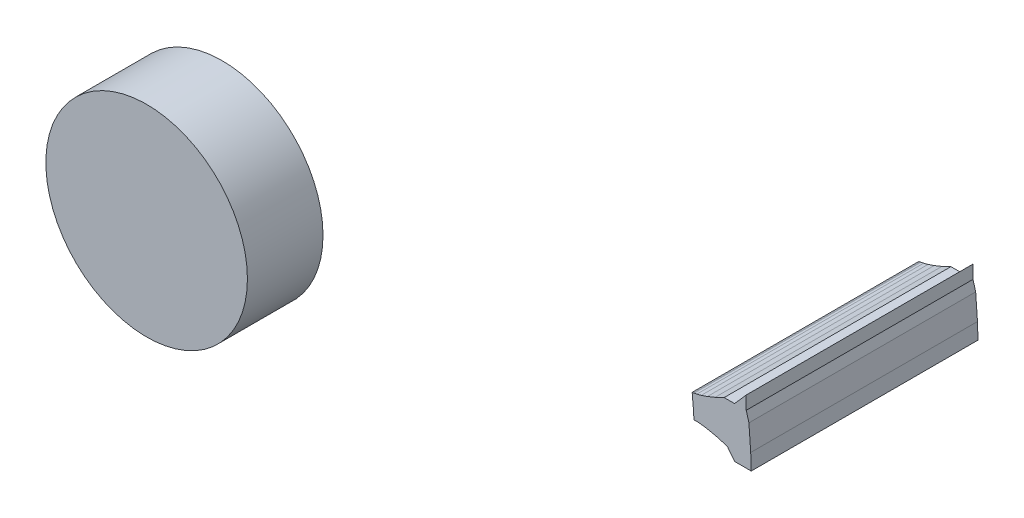
ISO-10303-21;
HEADER;
FILE_DESCRIPTION(('STEP AP214'),'2;1');
FILE_NAME('part.step','',(''),(''),'','','');
FILE_SCHEMA(('AUTOMOTIVE_DESIGN { 1 0 10303 214 1 1 1 1 }'));
ENDSEC;
DATA;
#1=APPLICATION_CONTEXT('core data for automotive mechanical design processes');
#2=APPLICATION_PROTOCOL_DEFINITION('international standard','automotive_design',2000,#1);
#3=PRODUCT_CONTEXT('',#1,'mechanical');
#4=PRODUCT('Part','Part','',(#3));
#5=PRODUCT_RELATED_PRODUCT_CATEGORY('part','',(#4));
#6=PRODUCT_DEFINITION_FORMATION('','',#4);
#7=PRODUCT_DEFINITION_CONTEXT('part definition',#1,'design');
#8=PRODUCT_DEFINITION('design','',#6,#7);
#9=PRODUCT_DEFINITION_SHAPE('','',#8);
#10=(LENGTH_UNIT() NAMED_UNIT(*) SI_UNIT(.MILLI.,.METRE.));
#11=(NAMED_UNIT(*) PLANE_ANGLE_UNIT() SI_UNIT($,.RADIAN.));
#12=(NAMED_UNIT(*) SI_UNIT($,.STERADIAN.) SOLID_ANGLE_UNIT());
#13=UNCERTAINTY_MEASURE_WITH_UNIT(LENGTH_MEASURE(1.E-05),#10,'distance_accuracy_value','');
#14=(GEOMETRIC_REPRESENTATION_CONTEXT(3) GLOBAL_UNCERTAINTY_ASSIGNED_CONTEXT((#13)) GLOBAL_UNIT_ASSIGNED_CONTEXT((#10,
#11,#12)) REPRESENTATION_CONTEXT('',''));
#15=CARTESIAN_POINT('',(0.,0.,0.));
#16=DIRECTION('',(0.,0.,1.));
#17=DIRECTION('',(1.,0.,0.));
#18=AXIS2_PLACEMENT_3D('',#15,#16,#17);
#19=CARTESIAN_POINT('',(0.,0.,24.));
#20=DIRECTION('',(0.,0.,-1.));
#21=DIRECTION('',(-1.,0.,0.));
#22=AXIS2_PLACEMENT_3D('',#19,#20,#21);
#23=CYLINDRICAL_SURFACE('',#22,8.);
#24=CARTESIAN_POINT('',(0.,0.,18.));
#25=DIRECTION('',(0.,0.,1.));
#26=DIRECTION('',(1.,0.,0.));
#27=AXIS2_PLACEMENT_3D('',#24,#25,#26);
#28=CIRCLE('',#27,8.);
#29=CARTESIAN_POINT('',(8.,0.,18.));
#30=VERTEX_POINT('',#29);
#31=EDGE_CURVE('E56',#30,#30,#28,.T.);
#32=ORIENTED_EDGE('',*,*,#31,.T.);
#33=EDGE_LOOP('',(#32));
#34=FACE_BOUND('',#33,.T.);
#35=CARTESIAN_POINT('',(0.,0.,24.));
#36=DIRECTION('',(0.,0.,1.));
#37=DIRECTION('',(1.,0.,0.));
#38=AXIS2_PLACEMENT_3D('',#35,#36,#37);
#39=CIRCLE('',#38,8.);
#40=CARTESIAN_POINT('',(8.,0.,24.));
#41=VERTEX_POINT('',#40);
#42=EDGE_CURVE('E12',#41,#41,#39,.T.);
#43=ORIENTED_EDGE('',*,*,#42,.F.);
#44=EDGE_LOOP('',(#43));
#45=FACE_BOUND('',#44,.T.);
#46=ADVANCED_FACE('F52',(#34,#45),#23,.T.);
#47=CARTESIAN_POINT('',(0.,0.,24.));
#48=DIRECTION('',(0.,0.,1.));
#49=DIRECTION('',(1.,0.,0.));
#50=AXIS2_PLACEMENT_3D('',#47,#48,#49);
#51=PLANE('',#50);
#52=ORIENTED_EDGE('',*,*,#42,.T.);
#53=EDGE_LOOP('',(#52));
#54=FACE_BOUND('',#53,.T.);
#55=ADVANCED_FACE('F68',(#54),#51,.T.);
#56=CARTESIAN_POINT('',(0.,0.,18.));
#57=DIRECTION('',(0.,0.,1.));
#58=DIRECTION('',(1.,0.,0.));
#59=AXIS2_PLACEMENT_3D('',#56,#57,#58);
#60=PLANE('',#59);
#61=ORIENTED_EDGE('',*,*,#31,.F.);
#62=EDGE_LOOP('',(#61));
#63=FACE_BOUND('',#62,.T.);
#64=ADVANCED_FACE('F54',(#63),#60,.F.);
#65=CLOSED_SHELL('',(#46,#55,#64));
#66=MANIFOLD_SOLID_BREP('B2',#65);
#67=CARTESIAN_POINT('',(0.,0.,0.));
#68=DIRECTION('',(0.,0.,1.));
#69=DIRECTION('',(1.,0.,0.));
#70=AXIS2_PLACEMENT_3D('',#67,#68,#69);
#71=PLANE('',#70);
#72=DIRECTION('',(0.0905981513208065,-0.995887531289177,0.));
#73=VECTOR('',#72,1.);
#74=CARTESIAN_POINT('',(37.3844000630674,2.94221547894263,0.));
#75=LINE('',#74,#73);
#76=CARTESIAN_POINT('',(37.3016220136472,3.8521416317403,0.));
#77=VERTEX_POINT('',#76);
#78=CARTESIAN_POINT('',(37.3844000630674,2.94221547894263,0.));
#79=VERTEX_POINT('',#78);
#80=EDGE_CURVE('E261',#77,#79,#75,.T.);
#81=ORIENTED_EDGE('',*,*,#80,.F.);
#82=DIRECTION('',(-0.994709920363927,-0.102723776846406,0.));
#83=VECTOR('',#82,1.);
#84=CARTESIAN_POINT('',(37.3016220136472,3.8521416317403,0.));
#85=LINE('',#84,#83);
#86=CARTESIAN_POINT('',(37.3888580736632,3.86115050696973,0.));
#87=VERTEX_POINT('',#86);
#88=EDGE_CURVE('E322',#87,#77,#85,.T.);
#89=ORIENTED_EDGE('',*,*,#88,.F.);
#90=DIRECTION('',(-0.989588019686755,-0.143928980029897,0.));
#91=VECTOR('',#90,1.);
#92=CARTESIAN_POINT('',(37.3888580736632,3.86115050696973,0.));
#93=LINE('',#92,#91);
#94=CARTESIAN_POINT('',(37.4610062205837,3.87164397393855,0.));
#95=VERTEX_POINT('',#94);
#96=EDGE_CURVE('E319',#95,#87,#93,.T.);
#97=ORIENTED_EDGE('',*,*,#96,.F.);
#98=DIRECTION('',(-0.980106852465355,-0.198470546304621,0.));
#99=VECTOR('',#98,1.);
#100=CARTESIAN_POINT('',(37.4610062205837,3.87164397393855,0.));
#101=LINE('',#100,#99);
#102=CARTESIAN_POINT('',(37.6753666553117,3.91505172328705,0.));
#103=VERTEX_POINT('',#102);
#104=EDGE_CURVE('E316',#103,#95,#101,.T.);
#105=ORIENTED_EDGE('',*,*,#104,.F.);
#106=DIRECTION('',(-0.966209673830987,-0.257757378546992,0.));
#107=VECTOR('',#106,1.);
#108=CARTESIAN_POINT('',(37.6753666553117,3.91505172328705,0.));
#109=LINE('',#108,#107);
#110=CARTESIAN_POINT('',(38.0275669136587,4.0090087781312,0.));
#111=VERTEX_POINT('',#110);
#112=EDGE_CURVE('E313',#111,#103,#109,.T.);
#113=ORIENTED_EDGE('',*,*,#112,.F.);
#114=DIRECTION('',(-0.948479410692144,-0.316838772079875,0.));
#115=VECTOR('',#114,1.);
#116=CARTESIAN_POINT('',(38.0275669136587,4.0090087781312,0.));
#117=LINE('',#116,#115);
#118=CARTESIAN_POINT('',(38.5115985785753,4.17069916026405,0.));
#119=VERTEX_POINT('',#118);
#120=EDGE_CURVE('E310',#119,#111,#117,.T.);
#121=ORIENTED_EDGE('',*,*,#120,.F.);
#122=DIRECTION('',(-0.927041376804356,-0.374959045353867,0.));
#123=VECTOR('',#122,1.);
#124=CARTESIAN_POINT('',(38.5115985785753,4.17069916026405,0.));
#125=LINE('',#124,#123);
#126=CARTESIAN_POINT('',(39.1198585891778,4.4167211810811,0.));
#127=VERTEX_POINT('',#126);
#128=EDGE_CURVE('E307',#127,#119,#125,.T.);
#129=ORIENTED_EDGE('',*,*,#128,.F.);
#130=DIRECTION('',(-0.901994032209611,-0.431748498385631,0.));
#131=VECTOR('',#130,1.);
#132=CARTESIAN_POINT('',(39.1198585891778,4.4167211810811,0.));
#133=LINE('',#132,#131);
#134=CARTESIAN_POINT('',(39.843200936271,4.76295625695094,0.));
#135=VERTEX_POINT('',#134);
#136=EDGE_CURVE('E304',#135,#127,#133,.T.);
#137=ORIENTED_EDGE('',*,*,#136,.F.);
#138=DIRECTION('',(-1.,0.,0.));
#139=VECTOR('',#138,1.);
#140=CARTESIAN_POINT('',(39.843200936271,4.76295625695094,0.));
#141=LINE('',#140,#139);
#142=CARTESIAN_POINT('',(40.670998457739,4.76295625695094,0.));
#143=VERTEX_POINT('',#142);
#144=EDGE_CURVE('E301',#143,#135,#141,.T.);
#145=ORIENTED_EDGE('',*,*,#144,.F.);
#146=DIRECTION('',(-0.659764565184818,-0.751472367107725,0.));
#147=VECTOR('',#146,1.);
#148=CARTESIAN_POINT('',(40.670998457739,4.76295625695094,0.));
#149=LINE('',#148,#147);
#150=CARTESIAN_POINT('',(41.5953853121842,5.81583362304391,0.));
#151=VERTEX_POINT('',#150);
#152=EDGE_CURVE('E298',#151,#143,#149,.T.);
#153=ORIENTED_EDGE('',*,*,#152,.F.);
#154=DIRECTION('',(0.,1.,0.));
#155=VECTOR('',#154,1.);
#156=CARTESIAN_POINT('',(41.5953853121842,5.81583362304391,0.));
#157=LINE('',#156,#155);
#158=CARTESIAN_POINT('',(41.5953853121842,4.76295625695094,0.));
#159=VERTEX_POINT('',#158);
#160=EDGE_CURVE('E294',#159,#151,#157,.T.);
#161=ORIENTED_EDGE('',*,*,#160,.F.);
#162=DIRECTION('',(-0.271684671108807,0.962386325487067,0.));
#163=VECTOR('',#162,1.);
#164=CARTESIAN_POINT('',(41.5953853121842,4.76295625695094,0.));
#165=LINE('',#164,#163);
#166=CARTESIAN_POINT('',(41.8082270446484,4.0090087781312,0.));
#167=VERTEX_POINT('',#166);
#168=EDGE_CURVE('E291',#167,#159,#165,.T.);
#169=ORIENTED_EDGE('',*,*,#168,.F.);
#170=DIRECTION('',(-0.07204163073137,0.997401625946923,0.));
#171=VECTOR('',#170,1.);
#172=CARTESIAN_POINT('',(41.8082270446484,4.0090087781312,0.));
#173=LINE('',#172,#171);
#174=CARTESIAN_POINT('',(41.9503880941238,2.04081815760224,0.));
#175=VERTEX_POINT('',#174);
#176=EDGE_CURVE('E295',#175,#167,#173,.T.);
#177=ORIENTED_EDGE('',*,*,#176,.F.);
#178=DIRECTION('',(-0.0336388276485857,0.999434054490054,0.));
#179=VECTOR('',#178,1.);
#180=CARTESIAN_POINT('',(41.9503880941238,2.04081815760239,0.));
#181=LINE('',#180,#179);
#182=CARTESIAN_POINT('',(41.9926721873227,0.784526970889533,0.));
#183=VERTEX_POINT('',#182);
#184=EDGE_CURVE('E96',#183,#175,#181,.T.);
#185=ORIENTED_EDGE('',*,*,#184,.F.);
#186=DIRECTION('',(1.,0.,0.));
#187=VECTOR('',#186,1.);
#188=CARTESIAN_POINT('',(41.9926721873227,0.784526970889533,0.));
#189=LINE('',#188,#187);
#190=CARTESIAN_POINT('',(40.670998457739,0.784526970889533,0.));
#191=VERTEX_POINT('',#190);
#192=EDGE_CURVE('E290',#191,#183,#189,.T.);
#193=ORIENTED_EDGE('',*,*,#192,.F.);
#194=DIRECTION('',(0.610333454309873,-0.792144604570515,0.));
#195=VECTOR('',#194,1.);
#196=CARTESIAN_POINT('',(40.670998457739,0.784526970889533,0.));
#197=LINE('',#196,#195);
#198=CARTESIAN_POINT('',(40.0977555807619,1.52853215182669,0.));
#199=VERTEX_POINT('',#198);
#200=EDGE_CURVE('E288',#199,#191,#197,.T.);
#201=ORIENTED_EDGE('',*,*,#200,.F.);
#202=DIRECTION('',(0.958429324952267,-0.285330035347738,0.));
#203=VECTOR('',#202,1.);
#204=CARTESIAN_POINT('',(40.0977555807619,1.52853215182669,0.));
#205=LINE('',#204,#203);
#206=CARTESIAN_POINT('',(39.329155686885,1.75734885137738,0.));
#207=VERTEX_POINT('',#206);
#208=EDGE_CURVE('E285',#207,#199,#205,.T.);
#209=ORIENTED_EDGE('',*,*,#208,.F.);
#210=DIRECTION('',(0.974284469427464,-0.225321487285269,0.));
#211=VECTOR('',#210,1.);
#212=CARTESIAN_POINT('',(39.329155686885,1.75734885137738,0.));
#213=LINE('',#212,#211);
#214=CARTESIAN_POINT('',(38.6898980479794,1.90518912439469,0.));
#215=VERTEX_POINT('',#214);
#216=EDGE_CURVE('E282',#215,#207,#213,.T.);
#217=ORIENTED_EDGE('',*,*,#216,.F.);
#218=DIRECTION('',(0.986366553671659,-0.164563124052426,0.));
#219=VECTOR('',#218,1.);
#220=CARTESIAN_POINT('',(38.6898980479794,1.90518912439469,0.));
#221=LINE('',#220,#219);
#222=CARTESIAN_POINT('',(38.1865316703758,1.98916961149967,0.));
#223=VERTEX_POINT('',#222);
#224=EDGE_CURVE('E279',#223,#215,#221,.T.);
#225=ORIENTED_EDGE('',*,*,#224,.F.);
#226=DIRECTION('',(0.994636163656049,-0.103435496554991,0.));
#227=VECTOR('',#226,1.);
#228=CARTESIAN_POINT('',(38.1865316703758,1.98916961149967,0.));
#229=LINE('',#228,#227);
#230=CARTESIAN_POINT('',(37.8239694612727,2.02687365193271,0.));
#231=VERTEX_POINT('',#230);
#232=EDGE_CURVE('E276',#231,#223,#229,.T.);
#233=ORIENTED_EDGE('',*,*,#232,.F.);
#234=DIRECTION('',(0.999087743059272,-0.0427045860386167,0.));
#235=VECTOR('',#234,1.);
#236=CARTESIAN_POINT('',(37.8239694612727,2.02687365193271,0.));
#237=LINE('',#236,#235);
#238=CARTESIAN_POINT('',(37.6054576914642,2.03621362706408,0.));
#239=VERTEX_POINT('',#238);
#240=EDGE_CURVE('E273',#239,#231,#237,.T.);
#241=ORIENTED_EDGE('',*,*,#240,.F.);
#242=DIRECTION('',(0.999920002445355,0.0126486643437654,0.));
#243=VECTOR('',#242,1.);
#244=CARTESIAN_POINT('',(37.6054576914642,2.03621362706408,0.));
#245=LINE('',#244,#243);
#246=CARTESIAN_POINT('',(37.5325562680334,2.03529144765683,0.));
#247=VERTEX_POINT('',#246);
#248=EDGE_CURVE('E267',#247,#239,#245,.T.);
#249=ORIENTED_EDGE('',*,*,#248,.F.);
#250=DIRECTION('',(0.998532931465171,0.0541478049377054,0.));
#251=VECTOR('',#250,1.);
#252=CARTESIAN_POINT('',(37.5325562680334,2.03529144765683,0.));
#253=LINE('',#252,#251);
#254=CARTESIAN_POINT('',(37.4449849299439,2.03054268516379,0.));
#255=VERTEX_POINT('',#254);
#256=EDGE_CURVE('E265',#255,#247,#253,.T.);
#257=ORIENTED_EDGE('',*,*,#256,.F.);
#258=DIRECTION('',(0.0602292012885529,-0.998184573769873,0.));
#259=VECTOR('',#258,1.);
#260=CARTESIAN_POINT('',(37.4449849299439,2.03054268516379,0.));
#261=LINE('',#260,#259);
#262=CARTESIAN_POINT('',(37.4174692012809,2.48656360690721,0.));
#263=VERTEX_POINT('',#262);
#264=EDGE_CURVE('E247',#263,#255,#261,.T.);
#265=ORIENTED_EDGE('',*,*,#264,.F.);
#266=DIRECTION('',(0.0723850640589552,-0.997376760558005,0.));
#267=VECTOR('',#266,1.);
#268=CARTESIAN_POINT('',(37.4174692012809,2.48656360690721,0.));
#269=LINE('',#268,#267);
#270=EDGE_CURVE('E257',#79,#263,#269,.T.);
#271=ORIENTED_EDGE('',*,*,#270,.F.);
#272=EDGE_LOOP('',(#81,#89,#97,#105,#113,#121,#129,#137,#145,#153,#161,#169,#177,#185,#193,#201,
#209,#217,#225,#233,#241,#249,#257,#265,#271));
#273=FACE_BOUND('',#272,.T.);
#274=ADVANCED_FACE('F93',(#273),#71,.F.);
#275=CARTESIAN_POINT('',(41.8082270446484,4.0090087781312,0.));
#276=DIRECTION('',(0.997401625946923,0.07204163073137,0.));
#277=DIRECTION('',(-0.07204163073137,0.997401625946923,0.));
#278=AXIS2_PLACEMENT_3D('',#275,#276,#277);
#279=PLANE('',#278);
#280=DIRECTION('',(-0.07204163073137,0.997401625946923,0.));
#281=VECTOR('',#280,1.);
#282=CARTESIAN_POINT('',(41.8082270446484,4.0090087781312,18.));
#283=LINE('',#282,#281);
#284=CARTESIAN_POINT('',(41.9503880941238,2.04081815760224,18.));
#285=VERTEX_POINT('',#284);
#286=CARTESIAN_POINT('',(41.8082270446484,4.0090087781312,18.));
#287=VERTEX_POINT('',#286);
#288=EDGE_CURVE('E360',#285,#287,#283,.T.);
#289=ORIENTED_EDGE('',*,*,#288,.F.);
#290=DIRECTION('',(0.,0.,1.));
#291=VECTOR('',#290,1.);
#292=CARTESIAN_POINT('',(41.9503880941238,2.04081815760239,0.));
#293=LINE('',#292,#291);
#294=EDGE_CURVE('E414',#175,#285,#293,.T.);
#295=ORIENTED_EDGE('',*,*,#294,.F.);
#296=ORIENTED_EDGE('',*,*,#176,.T.);
#297=DIRECTION('',(0.,0.,1.));
#298=VECTOR('',#297,1.);
#299=CARTESIAN_POINT('',(41.8082270446484,4.0090087781312,0.));
#300=LINE('',#299,#298);
#301=EDGE_CURVE('E412',#167,#287,#300,.T.);
#302=ORIENTED_EDGE('',*,*,#301,.T.);
#303=EDGE_LOOP('',(#289,#295,#296,#302));
#304=FACE_BOUND('',#303,.T.);
#305=ADVANCED_FACE('F445',(#304),#279,.T.);
#306=CARTESIAN_POINT('',(41.5953853121842,4.76295625695094,0.));
#307=DIRECTION('',(0.962386325487067,0.271684671108807,0.));
#308=DIRECTION('',(-0.271684671108807,0.962386325487067,0.));
#309=AXIS2_PLACEMENT_3D('',#306,#307,#308);
#310=PLANE('',#309);
#311=DIRECTION('',(-0.271684671108807,0.962386325487067,0.));
#312=VECTOR('',#311,1.);
#313=CARTESIAN_POINT('',(41.5953853121842,4.76295625695094,18.));
#314=LINE('',#313,#312);
#315=CARTESIAN_POINT('',(41.5953853121842,4.76295625695094,18.));
#316=VERTEX_POINT('',#315);
#317=EDGE_CURVE('E356',#287,#316,#314,.T.);
#318=ORIENTED_EDGE('',*,*,#317,.F.);
#319=ORIENTED_EDGE('',*,*,#301,.F.);
#320=ORIENTED_EDGE('',*,*,#168,.T.);
#321=DIRECTION('',(0.,0.,1.));
#322=VECTOR('',#321,1.);
#323=CARTESIAN_POINT('',(41.5953853121842,4.76295625695094,0.));
#324=LINE('',#323,#322);
#325=EDGE_CURVE('E410',#159,#316,#324,.T.);
#326=ORIENTED_EDGE('',*,*,#325,.T.);
#327=EDGE_LOOP('',(#318,#319,#320,#326));
#328=FACE_BOUND('',#327,.T.);
#329=ADVANCED_FACE('F451',(#328),#310,.T.);
#330=CARTESIAN_POINT('',(41.5953853121842,5.81583362304391,0.));
#331=DIRECTION('',(1.,0.,0.));
#332=DIRECTION('',(0.,0.,-1.));
#333=AXIS2_PLACEMENT_3D('',#330,#331,#332);
#334=PLANE('',#333);
#335=DIRECTION('',(0.,1.,0.));
#336=VECTOR('',#335,1.);
#337=CARTESIAN_POINT('',(41.5953853121842,5.81583362304391,18.));
#338=LINE('',#337,#336);
#339=CARTESIAN_POINT('',(41.5953853121842,5.81583362304391,18.));
#340=VERTEX_POINT('',#339);
#341=EDGE_CURVE('E359',#316,#340,#338,.T.);
#342=ORIENTED_EDGE('',*,*,#341,.F.);
#343=ORIENTED_EDGE('',*,*,#325,.F.);
#344=ORIENTED_EDGE('',*,*,#160,.T.);
#345=DIRECTION('',(0.,0.,1.));
#346=VECTOR('',#345,1.);
#347=CARTESIAN_POINT('',(41.5953853121842,5.81583362304391,0.));
#348=LINE('',#347,#346);
#349=EDGE_CURVE('E408',#151,#340,#348,.T.);
#350=ORIENTED_EDGE('',*,*,#349,.T.);
#351=EDGE_LOOP('',(#342,#343,#344,#350));
#352=FACE_BOUND('',#351,.T.);
#353=ADVANCED_FACE('F533',(#352),#334,.T.);
#354=CARTESIAN_POINT('',(40.670998457739,4.76295625695094,0.));
#355=DIRECTION('',(-0.751472367107725,0.659764565184818,0.));
#356=DIRECTION('',(-0.659764565184818,-0.751472367107725,0.));
#357=AXIS2_PLACEMENT_3D('',#354,#355,#356);
#358=PLANE('',#357);
#359=DIRECTION('',(-0.659764565184818,-0.751472367107725,0.));
#360=VECTOR('',#359,1.);
#361=CARTESIAN_POINT('',(40.670998457739,4.76295625695094,18.));
#362=LINE('',#361,#360);
#363=CARTESIAN_POINT('',(40.670998457739,4.76295625695094,18.));
#364=VERTEX_POINT('',#363);
#365=EDGE_CURVE('E363',#340,#364,#362,.T.);
#366=ORIENTED_EDGE('',*,*,#365,.F.);
#367=ORIENTED_EDGE('',*,*,#349,.F.);
#368=ORIENTED_EDGE('',*,*,#152,.T.);
#369=DIRECTION('',(0.,0.,1.));
#370=VECTOR('',#369,1.);
#371=CARTESIAN_POINT('',(40.670998457739,4.76295625695094,0.));
#372=LINE('',#371,#370);
#373=EDGE_CURVE('E406',#143,#364,#372,.T.);
#374=ORIENTED_EDGE('',*,*,#373,.T.);
#375=EDGE_LOOP('',(#366,#367,#368,#374));
#376=FACE_BOUND('',#375,.T.);
#377=ADVANCED_FACE('F531',(#376),#358,.T.);
#378=CARTESIAN_POINT('',(39.843200936271,4.76295625695094,0.));
#379=DIRECTION('',(0.,1.,0.));
#380=DIRECTION('',(0.,0.,1.));
#381=AXIS2_PLACEMENT_3D('',#378,#379,#380);
#382=PLANE('',#381);
#383=DIRECTION('',(-1.,0.,0.));
#384=VECTOR('',#383,1.);
#385=CARTESIAN_POINT('',(39.843200936271,4.76295625695094,18.));
#386=LINE('',#385,#384);
#387=CARTESIAN_POINT('',(39.843200936271,4.76295625695094,18.));
#388=VERTEX_POINT('',#387);
#389=EDGE_CURVE('E366',#364,#388,#386,.T.);
#390=ORIENTED_EDGE('',*,*,#389,.F.);
#391=ORIENTED_EDGE('',*,*,#373,.F.);
#392=ORIENTED_EDGE('',*,*,#144,.T.);
#393=DIRECTION('',(0.,0.,1.));
#394=VECTOR('',#393,1.);
#395=CARTESIAN_POINT('',(39.843200936271,4.76295625695094,0.));
#396=LINE('',#395,#394);
#397=EDGE_CURVE('E404',#135,#388,#396,.T.);
#398=ORIENTED_EDGE('',*,*,#397,.T.);
#399=EDGE_LOOP('',(#390,#391,#392,#398));
#400=FACE_BOUND('',#399,.T.);
#401=ADVANCED_FACE('F528',(#400),#382,.T.);
#402=CARTESIAN_POINT('',(39.1198585891778,4.4167211810811,0.));
#403=DIRECTION('',(-0.431748498385631,0.901994032209611,0.));
#404=DIRECTION('',(-0.901994032209611,-0.431748498385631,0.));
#405=AXIS2_PLACEMENT_3D('',#402,#403,#404);
#406=PLANE('',#405);
#407=DIRECTION('',(-0.901994032209611,-0.431748498385631,0.));
#408=VECTOR('',#407,1.);
#409=CARTESIAN_POINT('',(39.1198585891778,4.4167211810811,18.));
#410=LINE('',#409,#408);
#411=CARTESIAN_POINT('',(39.1198585891778,4.4167211810811,18.));
#412=VERTEX_POINT('',#411);
#413=EDGE_CURVE('E369',#388,#412,#410,.T.);
#414=ORIENTED_EDGE('',*,*,#413,.F.);
#415=ORIENTED_EDGE('',*,*,#397,.F.);
#416=ORIENTED_EDGE('',*,*,#136,.T.);
#417=DIRECTION('',(0.,0.,1.));
#418=VECTOR('',#417,1.);
#419=CARTESIAN_POINT('',(39.1198585891778,4.4167211810811,0.));
#420=LINE('',#419,#418);
#421=EDGE_CURVE('E402',#127,#412,#420,.T.);
#422=ORIENTED_EDGE('',*,*,#421,.T.);
#423=EDGE_LOOP('',(#414,#415,#416,#422));
#424=FACE_BOUND('',#423,.T.);
#425=ADVANCED_FACE('F525',(#424),#406,.T.);
#426=CARTESIAN_POINT('',(38.5115985785753,4.17069916026405,0.));
#427=DIRECTION('',(-0.374959045353867,0.927041376804356,0.));
#428=DIRECTION('',(-0.927041376804356,-0.374959045353867,0.));
#429=AXIS2_PLACEMENT_3D('',#426,#427,#428);
#430=PLANE('',#429);
#431=DIRECTION('',(-0.927041376804356,-0.374959045353867,0.));
#432=VECTOR('',#431,1.);
#433=CARTESIAN_POINT('',(38.5115985785753,4.17069916026405,18.));
#434=LINE('',#433,#432);
#435=CARTESIAN_POINT('',(38.5115985785753,4.17069916026405,18.));
#436=VERTEX_POINT('',#435);
#437=EDGE_CURVE('E372',#412,#436,#434,.T.);
#438=ORIENTED_EDGE('',*,*,#437,.F.);
#439=ORIENTED_EDGE('',*,*,#421,.F.);
#440=ORIENTED_EDGE('',*,*,#128,.T.);
#441=DIRECTION('',(0.,0.,1.));
#442=VECTOR('',#441,1.);
#443=CARTESIAN_POINT('',(38.5115985785753,4.17069916026405,0.));
#444=LINE('',#443,#442);
#445=EDGE_CURVE('E400',#119,#436,#444,.T.);
#446=ORIENTED_EDGE('',*,*,#445,.T.);
#447=EDGE_LOOP('',(#438,#439,#440,#446));
#448=FACE_BOUND('',#447,.T.);
#449=ADVANCED_FACE('F520',(#448),#430,.T.);
#450=CARTESIAN_POINT('',(38.0275669136587,4.0090087781312,0.));
#451=DIRECTION('',(-0.316838772079875,0.948479410692144,0.));
#452=DIRECTION('',(-0.948479410692144,-0.316838772079875,0.));
#453=AXIS2_PLACEMENT_3D('',#450,#451,#452);
#454=PLANE('',#453);
#455=DIRECTION('',(-0.948479410692144,-0.316838772079875,0.));
#456=VECTOR('',#455,1.);
#457=CARTESIAN_POINT('',(38.0275669136587,4.0090087781312,18.));
#458=LINE('',#457,#456);
#459=CARTESIAN_POINT('',(38.0275669136587,4.0090087781312,18.));
#460=VERTEX_POINT('',#459);
#461=EDGE_CURVE('E375',#436,#460,#458,.T.);
#462=ORIENTED_EDGE('',*,*,#461,.F.);
#463=ORIENTED_EDGE('',*,*,#445,.F.);
#464=ORIENTED_EDGE('',*,*,#120,.T.);
#465=DIRECTION('',(0.,0.,1.));
#466=VECTOR('',#465,1.);
#467=CARTESIAN_POINT('',(38.0275669136587,4.0090087781312,0.));
#468=LINE('',#467,#466);
#469=EDGE_CURVE('E398',#111,#460,#468,.T.);
#470=ORIENTED_EDGE('',*,*,#469,.T.);
#471=EDGE_LOOP('',(#462,#463,#464,#470));
#472=FACE_BOUND('',#471,.T.);
#473=ADVANCED_FACE('F517',(#472),#454,.T.);
#474=CARTESIAN_POINT('',(37.6753666553117,3.91505172328705,0.));
#475=DIRECTION('',(-0.257757378546992,0.966209673830987,0.));
#476=DIRECTION('',(-0.966209673830987,-0.257757378546992,0.));
#477=AXIS2_PLACEMENT_3D('',#474,#475,#476);
#478=PLANE('',#477);
#479=DIRECTION('',(-0.966209673830987,-0.257757378546992,0.));
#480=VECTOR('',#479,1.);
#481=CARTESIAN_POINT('',(37.6753666553117,3.91505172328705,18.));
#482=LINE('',#481,#480);
#483=CARTESIAN_POINT('',(37.6753666553117,3.91505172328705,18.));
#484=VERTEX_POINT('',#483);
#485=EDGE_CURVE('E378',#460,#484,#482,.T.);
#486=ORIENTED_EDGE('',*,*,#485,.F.);
#487=ORIENTED_EDGE('',*,*,#469,.F.);
#488=ORIENTED_EDGE('',*,*,#112,.T.);
#489=DIRECTION('',(0.,0.,1.));
#490=VECTOR('',#489,1.);
#491=CARTESIAN_POINT('',(37.6753666553117,3.91505172328705,0.));
#492=LINE('',#491,#490);
#493=EDGE_CURVE('E396',#103,#484,#492,.T.);
#494=ORIENTED_EDGE('',*,*,#493,.T.);
#495=EDGE_LOOP('',(#486,#487,#488,#494));
#496=FACE_BOUND('',#495,.T.);
#497=ADVANCED_FACE('F514',(#496),#478,.T.);
#498=CARTESIAN_POINT('',(37.4610062205837,3.87164397393855,0.));
#499=DIRECTION('',(-0.198470546304621,0.980106852465355,0.));
#500=DIRECTION('',(-0.980106852465355,-0.198470546304621,0.));
#501=AXIS2_PLACEMENT_3D('',#498,#499,#500);
#502=PLANE('',#501);
#503=DIRECTION('',(-0.980106852465355,-0.198470546304621,0.));
#504=VECTOR('',#503,1.);
#505=CARTESIAN_POINT('',(37.4610062205837,3.87164397393855,18.));
#506=LINE('',#505,#504);
#507=CARTESIAN_POINT('',(37.4610062205837,3.87164397393855,18.));
#508=VERTEX_POINT('',#507);
#509=EDGE_CURVE('E381',#484,#508,#506,.T.);
#510=ORIENTED_EDGE('',*,*,#509,.F.);
#511=ORIENTED_EDGE('',*,*,#493,.F.);
#512=ORIENTED_EDGE('',*,*,#104,.T.);
#513=DIRECTION('',(0.,0.,1.));
#514=VECTOR('',#513,1.);
#515=CARTESIAN_POINT('',(37.4610062205837,3.87164397393855,0.));
#516=LINE('',#515,#514);
#517=EDGE_CURVE('E394',#95,#508,#516,.T.);
#518=ORIENTED_EDGE('',*,*,#517,.T.);
#519=EDGE_LOOP('',(#510,#511,#512,#518));
#520=FACE_BOUND('',#519,.T.);
#521=ADVANCED_FACE('F508',(#520),#502,.T.);
#522=CARTESIAN_POINT('',(37.3888580736632,3.86115050696973,0.));
#523=DIRECTION('',(-0.143928980029897,0.989588019686755,0.));
#524=DIRECTION('',(-0.989588019686755,-0.143928980029897,0.));
#525=AXIS2_PLACEMENT_3D('',#522,#523,#524);
#526=PLANE('',#525);
#527=DIRECTION('',(-0.989588019686755,-0.143928980029897,0.));
#528=VECTOR('',#527,1.);
#529=CARTESIAN_POINT('',(37.3888580736632,3.86115050696973,18.));
#530=LINE('',#529,#528);
#531=CARTESIAN_POINT('',(37.3888580736632,3.86115050696973,18.));
#532=VERTEX_POINT('',#531);
#533=EDGE_CURVE('E384',#508,#532,#530,.T.);
#534=ORIENTED_EDGE('',*,*,#533,.F.);
#535=ORIENTED_EDGE('',*,*,#517,.F.);
#536=ORIENTED_EDGE('',*,*,#96,.T.);
#537=DIRECTION('',(0.,0.,1.));
#538=VECTOR('',#537,1.);
#539=CARTESIAN_POINT('',(37.3888580736632,3.86115050696973,0.));
#540=LINE('',#539,#538);
#541=EDGE_CURVE('E392',#87,#532,#540,.T.);
#542=ORIENTED_EDGE('',*,*,#541,.T.);
#543=EDGE_LOOP('',(#534,#535,#536,#542));
#544=FACE_BOUND('',#543,.T.);
#545=ADVANCED_FACE('F505',(#544),#526,.T.);
#546=CARTESIAN_POINT('',(37.3016220136472,3.8521416317403,0.));
#547=DIRECTION('',(-0.102723776846406,0.994709920363927,0.));
#548=DIRECTION('',(-0.994709920363927,-0.102723776846406,0.));
#549=AXIS2_PLACEMENT_3D('',#546,#547,#548);
#550=PLANE('',#549);
#551=DIRECTION('',(-0.994709920363927,-0.102723776846406,0.));
#552=VECTOR('',#551,1.);
#553=CARTESIAN_POINT('',(37.3016220136472,3.8521416317403,18.));
#554=LINE('',#553,#552);
#555=CARTESIAN_POINT('',(37.3016220136472,3.8521416317403,18.));
#556=VERTEX_POINT('',#555);
#557=EDGE_CURVE('E387',#532,#556,#554,.T.);
#558=ORIENTED_EDGE('',*,*,#557,.F.);
#559=ORIENTED_EDGE('',*,*,#541,.F.);
#560=ORIENTED_EDGE('',*,*,#88,.T.);
#561=DIRECTION('',(0.,0.,1.));
#562=VECTOR('',#561,1.);
#563=CARTESIAN_POINT('',(37.3016220136472,3.8521416317403,0.));
#564=LINE('',#563,#562);
#565=EDGE_CURVE('E390',#77,#556,#564,.T.);
#566=ORIENTED_EDGE('',*,*,#565,.T.);
#567=EDGE_LOOP('',(#558,#559,#560,#566));
#568=FACE_BOUND('',#567,.T.);
#569=ADVANCED_FACE('F502',(#568),#550,.T.);
#570=CARTESIAN_POINT('',(37.4174692012809,2.48656360690721,0.));
#571=DIRECTION('',(-0.997376760558005,-0.0723850640589552,0.));
#572=DIRECTION('',(0.0723850640589552,-0.997376760558006,0.));
#573=AXIS2_PLACEMENT_3D('',#570,#571,#572);
#574=PLANE('',#573);
#575=DIRECTION('',(0.0723850640589552,-0.997376760558005,0.));
#576=VECTOR('',#575,1.);
#577=CARTESIAN_POINT('',(37.4174692012809,2.48656360690721,18.));
#578=LINE('',#577,#576);
#579=CARTESIAN_POINT('',(37.3844000630674,2.94221547894263,18.));
#580=VERTEX_POINT('',#579);
#581=CARTESIAN_POINT('',(37.4174692012809,2.48656360690721,18.));
#582=VERTEX_POINT('',#581);
#583=EDGE_CURVE('E328',#580,#582,#578,.T.);
#584=ORIENTED_EDGE('',*,*,#583,.F.);
#585=DIRECTION('',(0.,0.,1.));
#586=VECTOR('',#585,1.);
#587=CARTESIAN_POINT('',(37.3844000630674,2.94221547894263,0.));
#588=LINE('',#587,#586);
#589=EDGE_CURVE('E253',#79,#580,#588,.T.);
#590=ORIENTED_EDGE('',*,*,#589,.F.);
#591=ORIENTED_EDGE('',*,*,#270,.T.);
#592=DIRECTION('',(0.,0.,1.));
#593=VECTOR('',#592,1.);
#594=CARTESIAN_POINT('',(37.4174692012809,2.48656360690721,0.));
#595=LINE('',#594,#593);
#596=EDGE_CURVE('E243',#263,#582,#595,.T.);
#597=ORIENTED_EDGE('',*,*,#596,.T.);
#598=EDGE_LOOP('',(#584,#590,#591,#597));
#599=FACE_BOUND('',#598,.T.);
#600=ADVANCED_FACE('F258',(#599),#574,.T.);
#601=CARTESIAN_POINT('',(37.4449849299439,2.03054268516379,0.));
#602=DIRECTION('',(-0.998184573769873,-0.0602292012885529,0.));
#603=DIRECTION('',(0.0602292012885529,-0.998184573769873,0.));
#604=AXIS2_PLACEMENT_3D('',#601,#602,#603);
#605=PLANE('',#604);
#606=DIRECTION('',(0.0602292012885529,-0.998184573769873,0.));
#607=VECTOR('',#606,1.);
#608=CARTESIAN_POINT('',(37.4449849299439,2.03054268516379,18.));
#609=LINE('',#608,#607);
#610=CARTESIAN_POINT('',(37.4449849299439,2.03054268516379,18.));
#611=VERTEX_POINT('',#610);
#612=EDGE_CURVE('E109',#582,#611,#609,.T.);
#613=ORIENTED_EDGE('',*,*,#612,.F.);
#614=ORIENTED_EDGE('',*,*,#596,.F.);
#615=ORIENTED_EDGE('',*,*,#264,.T.);
#616=DIRECTION('',(0.,0.,1.));
#617=VECTOR('',#616,1.);
#618=CARTESIAN_POINT('',(37.4449849299439,2.03054268516379,0.));
#619=LINE('',#618,#617);
#620=EDGE_CURVE('E252',#255,#611,#619,.T.);
#621=ORIENTED_EDGE('',*,*,#620,.T.);
#622=EDGE_LOOP('',(#613,#614,#615,#621));
#623=FACE_BOUND('',#622,.T.);
#624=ADVANCED_FACE('F245',(#623),#605,.T.);
#625=CARTESIAN_POINT('',(37.5325562680334,2.03529144765683,0.));
#626=DIRECTION('',(0.0541478049377054,-0.998532931465171,0.));
#627=DIRECTION('',(0.998532931465171,0.0541478049377054,0.));
#628=AXIS2_PLACEMENT_3D('',#625,#626,#627);
#629=PLANE('',#628);
#630=DIRECTION('',(0.998532931465171,0.0541478049377054,0.));
#631=VECTOR('',#630,1.);
#632=CARTESIAN_POINT('',(37.5325562680334,2.03529144765683,18.));
#633=LINE('',#632,#631);
#634=CARTESIAN_POINT('',(37.5325562680334,2.03529144765683,18.));
#635=VERTEX_POINT('',#634);
#636=EDGE_CURVE('E331',#611,#635,#633,.T.);
#637=ORIENTED_EDGE('',*,*,#636,.F.);
#638=ORIENTED_EDGE('',*,*,#620,.F.);
#639=ORIENTED_EDGE('',*,*,#256,.T.);
#640=DIRECTION('',(0.,0.,1.));
#641=VECTOR('',#640,1.);
#642=CARTESIAN_POINT('',(37.5325562680334,2.03529144765683,0.));
#643=LINE('',#642,#641);
#644=EDGE_CURVE('E428',#247,#635,#643,.T.);
#645=ORIENTED_EDGE('',*,*,#644,.T.);
#646=EDGE_LOOP('',(#637,#638,#639,#645));
#647=FACE_BOUND('',#646,.T.);
#648=ADVANCED_FACE('F492',(#647),#629,.T.);
#649=CARTESIAN_POINT('',(37.6054576914642,2.03621362706408,0.));
#650=DIRECTION('',(0.0126486643437654,-0.999920002445355,0.));
#651=DIRECTION('',(0.999920002445355,0.0126486643437655,0.));
#652=AXIS2_PLACEMENT_3D('',#649,#650,#651);
#653=PLANE('',#652);
#654=DIRECTION('',(0.999920002445355,0.0126486643437654,0.));
#655=VECTOR('',#654,1.);
#656=CARTESIAN_POINT('',(37.6054576914642,2.03621362706408,18.));
#657=LINE('',#656,#655);
#658=CARTESIAN_POINT('',(37.6054576914642,2.03621362706408,18.));
#659=VERTEX_POINT('',#658);
#660=EDGE_CURVE('E334',#635,#659,#657,.T.);
#661=ORIENTED_EDGE('',*,*,#660,.F.);
#662=ORIENTED_EDGE('',*,*,#644,.F.);
#663=ORIENTED_EDGE('',*,*,#248,.T.);
#664=DIRECTION('',(0.,0.,1.));
#665=VECTOR('',#664,1.);
#666=CARTESIAN_POINT('',(37.6054576914642,2.03621362706408,0.));
#667=LINE('',#666,#665);
#668=EDGE_CURVE('E426',#239,#659,#667,.T.);
#669=ORIENTED_EDGE('',*,*,#668,.T.);
#670=EDGE_LOOP('',(#661,#662,#663,#669));
#671=FACE_BOUND('',#670,.T.);
#672=ADVANCED_FACE('F571',(#671),#653,.T.);
#673=CARTESIAN_POINT('',(37.8239694612727,2.02687365193271,0.));
#674=DIRECTION('',(-0.0427045860386167,-0.999087743059272,0.));
#675=DIRECTION('',(0.999087743059272,-0.0427045860386167,0.));
#676=AXIS2_PLACEMENT_3D('',#673,#674,#675);
#677=PLANE('',#676);
#678=DIRECTION('',(0.999087743059272,-0.0427045860386167,0.));
#679=VECTOR('',#678,1.);
#680=CARTESIAN_POINT('',(37.8239694612727,2.02687365193271,18.));
#681=LINE('',#680,#679);
#682=CARTESIAN_POINT('',(37.8239694612727,2.02687365193271,18.));
#683=VERTEX_POINT('',#682);
#684=EDGE_CURVE('E337',#659,#683,#681,.T.);
#685=ORIENTED_EDGE('',*,*,#684,.F.);
#686=ORIENTED_EDGE('',*,*,#668,.F.);
#687=ORIENTED_EDGE('',*,*,#240,.T.);
#688=DIRECTION('',(0.,0.,1.));
#689=VECTOR('',#688,1.);
#690=CARTESIAN_POINT('',(37.8239694612727,2.02687365193271,0.));
#691=LINE('',#690,#689);
#692=EDGE_CURVE('E424',#231,#683,#691,.T.);
#693=ORIENTED_EDGE('',*,*,#692,.T.);
#694=EDGE_LOOP('',(#685,#686,#687,#693));
#695=FACE_BOUND('',#694,.T.);
#696=ADVANCED_FACE('F567',(#695),#677,.T.);
#697=CARTESIAN_POINT('',(38.1865316703758,1.98916961149967,0.));
#698=DIRECTION('',(-0.103435496554991,-0.994636163656049,0.));
#699=DIRECTION('',(0.994636163656049,-0.103435496554991,0.));
#700=AXIS2_PLACEMENT_3D('',#697,#698,#699);
#701=PLANE('',#700);
#702=DIRECTION('',(0.994636163656049,-0.103435496554991,0.));
#703=VECTOR('',#702,1.);
#704=CARTESIAN_POINT('',(38.1865316703758,1.98916961149967,18.));
#705=LINE('',#704,#703);
#706=CARTESIAN_POINT('',(38.1865316703758,1.98916961149967,18.));
#707=VERTEX_POINT('',#706);
#708=EDGE_CURVE('E340',#683,#707,#705,.T.);
#709=ORIENTED_EDGE('',*,*,#708,.F.);
#710=ORIENTED_EDGE('',*,*,#692,.F.);
#711=ORIENTED_EDGE('',*,*,#232,.T.);
#712=DIRECTION('',(0.,0.,1.));
#713=VECTOR('',#712,1.);
#714=CARTESIAN_POINT('',(38.1865316703758,1.98916961149967,0.));
#715=LINE('',#714,#713);
#716=EDGE_CURVE('E422',#223,#707,#715,.T.);
#717=ORIENTED_EDGE('',*,*,#716,.T.);
#718=EDGE_LOOP('',(#709,#710,#711,#717));
#719=FACE_BOUND('',#718,.T.);
#720=ADVANCED_FACE('F563',(#719),#701,.T.);
#721=CARTESIAN_POINT('',(38.6898980479794,1.90518912439469,0.));
#722=DIRECTION('',(-0.164563124052426,-0.986366553671659,0.));
#723=DIRECTION('',(0.986366553671659,-0.164563124052426,0.));
#724=AXIS2_PLACEMENT_3D('',#721,#722,#723);
#725=PLANE('',#724);
#726=DIRECTION('',(0.986366553671659,-0.164563124052426,0.));
#727=VECTOR('',#726,1.);
#728=CARTESIAN_POINT('',(38.6898980479794,1.90518912439469,18.));
#729=LINE('',#728,#727);
#730=CARTESIAN_POINT('',(38.6898980479794,1.90518912439469,18.));
#731=VERTEX_POINT('',#730);
#732=EDGE_CURVE('E343',#707,#731,#729,.T.);
#733=ORIENTED_EDGE('',*,*,#732,.F.);
#734=ORIENTED_EDGE('',*,*,#716,.F.);
#735=ORIENTED_EDGE('',*,*,#224,.T.);
#736=DIRECTION('',(0.,0.,1.));
#737=VECTOR('',#736,1.);
#738=CARTESIAN_POINT('',(38.6898980479794,1.90518912439469,0.));
#739=LINE('',#738,#737);
#740=EDGE_CURVE('E420',#215,#731,#739,.T.);
#741=ORIENTED_EDGE('',*,*,#740,.T.);
#742=EDGE_LOOP('',(#733,#734,#735,#741));
#743=FACE_BOUND('',#742,.T.);
#744=ADVANCED_FACE('F560',(#743),#725,.T.);
#745=CARTESIAN_POINT('',(39.329155686885,1.75734885137738,0.));
#746=DIRECTION('',(-0.225321487285269,-0.974284469427464,0.));
#747=DIRECTION('',(0.974284469427464,-0.225321487285269,0.));
#748=AXIS2_PLACEMENT_3D('',#745,#746,#747);
#749=PLANE('',#748);
#750=DIRECTION('',(0.974284469427464,-0.225321487285269,0.));
#751=VECTOR('',#750,1.);
#752=CARTESIAN_POINT('',(39.329155686885,1.75734885137738,18.));
#753=LINE('',#752,#751);
#754=CARTESIAN_POINT('',(39.329155686885,1.75734885137738,18.));
#755=VERTEX_POINT('',#754);
#756=EDGE_CURVE('E346',#731,#755,#753,.T.);
#757=ORIENTED_EDGE('',*,*,#756,.F.);
#758=ORIENTED_EDGE('',*,*,#740,.F.);
#759=ORIENTED_EDGE('',*,*,#216,.T.);
#760=DIRECTION('',(0.,0.,1.));
#761=VECTOR('',#760,1.);
#762=CARTESIAN_POINT('',(39.329155686885,1.75734885137738,0.));
#763=LINE('',#762,#761);
#764=EDGE_CURVE('E418',#207,#755,#763,.T.);
#765=ORIENTED_EDGE('',*,*,#764,.T.);
#766=EDGE_LOOP('',(#757,#758,#759,#765));
#767=FACE_BOUND('',#766,.T.);
#768=ADVANCED_FACE('F472',(#767),#749,.T.);
#769=CARTESIAN_POINT('',(40.0977555807619,1.52853215182669,0.));
#770=DIRECTION('',(-0.285330035347738,-0.958429324952267,0.));
#771=DIRECTION('',(0.958429324952267,-0.285330035347738,0.));
#772=AXIS2_PLACEMENT_3D('',#769,#770,#771);
#773=PLANE('',#772);
#774=DIRECTION('',(0.958429324952267,-0.285330035347738,0.));
#775=VECTOR('',#774,1.);
#776=CARTESIAN_POINT('',(40.0977555807619,1.52853215182669,18.));
#777=LINE('',#776,#775);
#778=CARTESIAN_POINT('',(40.0977555807619,1.52853215182669,18.));
#779=VERTEX_POINT('',#778);
#780=EDGE_CURVE('E349',#755,#779,#777,.T.);
#781=ORIENTED_EDGE('',*,*,#780,.F.);
#782=ORIENTED_EDGE('',*,*,#764,.F.);
#783=ORIENTED_EDGE('',*,*,#208,.T.);
#784=DIRECTION('',(0.,0.,1.));
#785=VECTOR('',#784,1.);
#786=CARTESIAN_POINT('',(40.0977555807619,1.52853215182669,0.));
#787=LINE('',#786,#785);
#788=EDGE_CURVE('E416',#199,#779,#787,.T.);
#789=ORIENTED_EDGE('',*,*,#788,.T.);
#790=EDGE_LOOP('',(#781,#782,#783,#789));
#791=FACE_BOUND('',#790,.T.);
#792=ADVANCED_FACE('F467',(#791),#773,.T.);
#793=CARTESIAN_POINT('',(40.670998457739,0.784526970889533,0.));
#794=DIRECTION('',(-0.792144604570515,-0.610333454309873,0.));
#795=DIRECTION('',(0.610333454309873,-0.792144604570515,0.));
#796=AXIS2_PLACEMENT_3D('',#793,#794,#795);
#797=PLANE('',#796);
#798=DIRECTION('',(0.610333454309873,-0.792144604570515,0.));
#799=VECTOR('',#798,1.);
#800=CARTESIAN_POINT('',(40.670998457739,0.784526970889533,18.));
#801=LINE('',#800,#799);
#802=CARTESIAN_POINT('',(40.670998457739,0.784526970889533,18.));
#803=VERTEX_POINT('',#802);
#804=EDGE_CURVE('E352',#779,#803,#801,.T.);
#805=ORIENTED_EDGE('',*,*,#804,.F.);
#806=ORIENTED_EDGE('',*,*,#788,.F.);
#807=ORIENTED_EDGE('',*,*,#200,.T.);
#808=DIRECTION('',(0.,0.,1.));
#809=VECTOR('',#808,1.);
#810=CARTESIAN_POINT('',(40.670998457739,0.784526970889533,0.));
#811=LINE('',#810,#809);
#812=EDGE_CURVE('E138',#191,#803,#811,.T.);
#813=ORIENTED_EDGE('',*,*,#812,.T.);
#814=EDGE_LOOP('',(#805,#806,#807,#813));
#815=FACE_BOUND('',#814,.T.);
#816=ADVANCED_FACE('F463',(#815),#797,.T.);
#817=CARTESIAN_POINT('',(41.9926721873227,0.784526970889533,0.));
#818=DIRECTION('',(0.,-1.,0.));
#819=DIRECTION('',(0.,0.,-1.));
#820=AXIS2_PLACEMENT_3D('',#817,#818,#819);
#821=PLANE('',#820);
#822=DIRECTION('',(1.,0.,0.));
#823=VECTOR('',#822,1.);
#824=CARTESIAN_POINT('',(41.9926721873227,0.784526970889533,18.));
#825=LINE('',#824,#823);
#826=CARTESIAN_POINT('',(41.9926721873227,0.784526970889533,18.));
#827=VERTEX_POINT('',#826);
#828=EDGE_CURVE('E355',#803,#827,#825,.T.);
#829=ORIENTED_EDGE('',*,*,#828,.F.);
#830=ORIENTED_EDGE('',*,*,#812,.F.);
#831=ORIENTED_EDGE('',*,*,#192,.T.);
#832=DIRECTION('',(0.,0.,1.));
#833=VECTOR('',#832,1.);
#834=CARTESIAN_POINT('',(41.9926721873227,0.784526970889533,0.));
#835=LINE('',#834,#833);
#836=EDGE_CURVE('E129',#183,#827,#835,.T.);
#837=ORIENTED_EDGE('',*,*,#836,.T.);
#838=EDGE_LOOP('',(#829,#830,#831,#837));
#839=FACE_BOUND('',#838,.T.);
#840=ADVANCED_FACE('F456',(#839),#821,.T.);
#841=CARTESIAN_POINT('',(37.3844000630674,2.94221547894263,0.));
#842=DIRECTION('',(-0.995887531289177,-0.0905981513208065,0.));
#843=DIRECTION('',(0.0905981513208065,-0.995887531289178,0.));
#844=AXIS2_PLACEMENT_3D('',#841,#842,#843);
#845=PLANE('',#844);
#846=DIRECTION('',(0.0905981513208065,-0.995887531289177,0.));
#847=VECTOR('',#846,1.);
#848=CARTESIAN_POINT('',(37.3844000630674,2.94221547894263,18.));
#849=LINE('',#848,#847);
#850=EDGE_CURVE('E325',#556,#580,#849,.T.);
#851=ORIENTED_EDGE('',*,*,#850,.F.);
#852=ORIENTED_EDGE('',*,*,#565,.F.);
#853=ORIENTED_EDGE('',*,*,#80,.T.);
#854=ORIENTED_EDGE('',*,*,#589,.T.);
#855=EDGE_LOOP('',(#851,#852,#853,#854));
#856=FACE_BOUND('',#855,.T.);
#857=ADVANCED_FACE('F497',(#856),#845,.T.);
#858=CARTESIAN_POINT('',(41.9503880941238,2.04081815760239,0.));
#859=DIRECTION('',(0.999434054490054,0.0336388276485856,0.));
#860=DIRECTION('',(-0.0336388276485857,0.999434054490054,0.));
#861=AXIS2_PLACEMENT_3D('',#858,#859,#860);
#862=PLANE('',#861);
#863=DIRECTION('',(-0.0336388276485898,0.999434054490054,0.));
#864=VECTOR('',#863,1.);
#865=CARTESIAN_POINT('',(41.9926721873227,0.784526970889533,18.));
#866=LINE('',#865,#864);
#867=EDGE_CURVE('E50',#827,#285,#866,.T.);
#868=ORIENTED_EDGE('',*,*,#867,.F.);
#869=ORIENTED_EDGE('',*,*,#836,.F.);
#870=ORIENTED_EDGE('',*,*,#184,.T.);
#871=ORIENTED_EDGE('',*,*,#294,.T.);
#872=EDGE_LOOP('',(#868,#869,#870,#871));
#873=FACE_BOUND('',#872,.T.);
#874=ADVANCED_FACE('F455',(#873),#862,.T.);
#875=CARTESIAN_POINT('',(0.,0.,18.));
#876=DIRECTION('',(0.,0.,1.));
#877=DIRECTION('',(1.,0.,0.));
#878=AXIS2_PLACEMENT_3D('',#875,#876,#877);
#879=PLANE('',#878);
#880=ORIENTED_EDGE('',*,*,#557,.T.);
#881=ORIENTED_EDGE('',*,*,#850,.T.);
#882=ORIENTED_EDGE('',*,*,#583,.T.);
#883=ORIENTED_EDGE('',*,*,#612,.T.);
#884=ORIENTED_EDGE('',*,*,#636,.T.);
#885=ORIENTED_EDGE('',*,*,#660,.T.);
#886=ORIENTED_EDGE('',*,*,#684,.T.);
#887=ORIENTED_EDGE('',*,*,#708,.T.);
#888=ORIENTED_EDGE('',*,*,#732,.T.);
#889=ORIENTED_EDGE('',*,*,#756,.T.);
#890=ORIENTED_EDGE('',*,*,#780,.T.);
#891=ORIENTED_EDGE('',*,*,#804,.T.);
#892=ORIENTED_EDGE('',*,*,#828,.T.);
#893=ORIENTED_EDGE('',*,*,#867,.T.);
#894=ORIENTED_EDGE('',*,*,#288,.T.);
#895=ORIENTED_EDGE('',*,*,#317,.T.);
#896=ORIENTED_EDGE('',*,*,#341,.T.);
#897=ORIENTED_EDGE('',*,*,#365,.T.);
#898=ORIENTED_EDGE('',*,*,#389,.T.);
#899=ORIENTED_EDGE('',*,*,#413,.T.);
#900=ORIENTED_EDGE('',*,*,#437,.T.);
#901=ORIENTED_EDGE('',*,*,#461,.T.);
#902=ORIENTED_EDGE('',*,*,#485,.T.);
#903=ORIENTED_EDGE('',*,*,#509,.T.);
#904=ORIENTED_EDGE('',*,*,#533,.T.);
#905=EDGE_LOOP('',(#880,#881,#882,#883,#884,#885,#886,#887,#888,#889,#890,#891,#892,#893,#894,
#895,#896,#897,#898,#899,#900,#901,#902,#903,#904));
#906=FACE_BOUND('',#905,.T.);
#907=ADVANCED_FACE('F454',(#906),#879,.T.);
#908=CLOSED_SHELL('',(#274,#305,#329,#353,#377,#401,#425,#449,#473,#497,#521,#545,#569,#600,
#624,#648,#672,#696,#720,#744,#768,#792,#816,#840,#857,#874,#907));
#909=MANIFOLD_SOLID_BREP('B7',#908);
#910=ADVANCED_BREP_SHAPE_REPRESENTATION('',(#18,#66,#909),#14);
#911=SHAPE_DEFINITION_REPRESENTATION(#9,#910);
ENDSEC;
END-ISO-10303-21;
